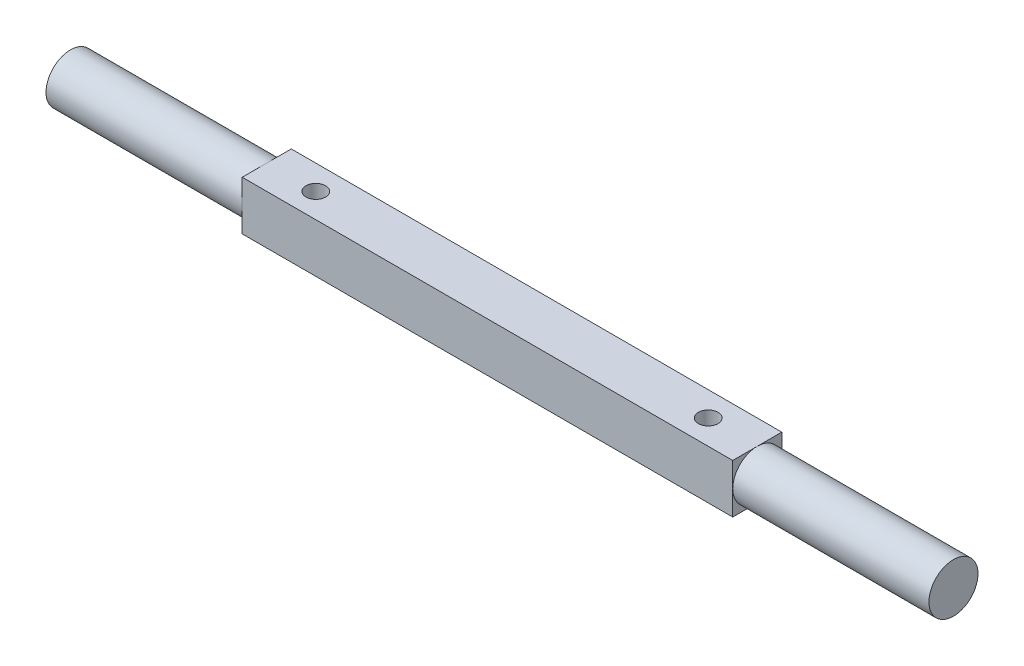
ISO-10303-21;
HEADER;
FILE_DESCRIPTION(('STEP AP214'),'2;1');
FILE_NAME('part.step','',(''),(''),'','','');
FILE_SCHEMA(('AUTOMOTIVE_DESIGN { 1 0 10303 214 1 1 1 1 }'));
ENDSEC;
DATA;
#1=APPLICATION_CONTEXT('core data for automotive mechanical design processes');
#2=APPLICATION_PROTOCOL_DEFINITION('international standard','automotive_design',2000,#1);
#3=PRODUCT_CONTEXT('',#1,'mechanical');
#4=PRODUCT('Part','Part','',(#3));
#5=PRODUCT_RELATED_PRODUCT_CATEGORY('part','',(#4));
#6=PRODUCT_DEFINITION_FORMATION('','',#4);
#7=PRODUCT_DEFINITION_CONTEXT('part definition',#1,'design');
#8=PRODUCT_DEFINITION('design','',#6,#7);
#9=PRODUCT_DEFINITION_SHAPE('','',#8);
#10=(LENGTH_UNIT() NAMED_UNIT(*) SI_UNIT(.MILLI.,.METRE.));
#11=(NAMED_UNIT(*) PLANE_ANGLE_UNIT() SI_UNIT($,.RADIAN.));
#12=(NAMED_UNIT(*) SI_UNIT($,.STERADIAN.) SOLID_ANGLE_UNIT());
#13=UNCERTAINTY_MEASURE_WITH_UNIT(LENGTH_MEASURE(1.E-05),#10,'distance_accuracy_value','');
#14=(GEOMETRIC_REPRESENTATION_CONTEXT(3) GLOBAL_UNCERTAINTY_ASSIGNED_CONTEXT((#13)) GLOBAL_UNIT_ASSIGNED_CONTEXT((#10,
#11,#12)) REPRESENTATION_CONTEXT('',''));
#15=CARTESIAN_POINT('',(0.,0.,0.));
#16=DIRECTION('',(0.,0.,1.));
#17=DIRECTION('',(1.,0.,0.));
#18=AXIS2_PLACEMENT_3D('',#15,#16,#17);
#19=CARTESIAN_POINT('',(-250.,25.,-25.));
#20=DIRECTION('',(1.,0.,0.));
#21=DIRECTION('',(0.,0.,-1.));
#22=AXIS2_PLACEMENT_3D('',#19,#20,#21);
#23=PLANE('',#22);
#24=CARTESIAN_POINT('',(-250.,0.,0.));
#25=DIRECTION('',(-1.,0.,0.));
#26=DIRECTION('',(0.,0.,1.));
#27=AXIS2_PLACEMENT_3D('',#24,#25,#26);
#28=CIRCLE('',#27,25.);
#29=CARTESIAN_POINT('',(-250.,0.,25.));
#30=VERTEX_POINT('',#29);
#31=CARTESIAN_POINT('',(-250.,25.,0.));
#32=VERTEX_POINT('',#31);
#33=EDGE_CURVE('E57',#30,#32,#28,.T.);
#34=ORIENTED_EDGE('',*,*,#33,.F.);
#35=DIRECTION('',(0.,-1.,0.));
#36=VECTOR('',#35,1.);
#37=CARTESIAN_POINT('',(-250.,25.,25.));
#38=LINE('',#37,#36);
#39=CARTESIAN_POINT('',(-250.,25.,25.));
#40=VERTEX_POINT('',#39);
#41=EDGE_CURVE('E114',#40,#30,#38,.T.);
#42=ORIENTED_EDGE('',*,*,#41,.F.);
#43=DIRECTION('',(0.,0.,1.));
#44=VECTOR('',#43,1.);
#45=CARTESIAN_POINT('',(-250.,25.,-25.));
#46=LINE('',#45,#44);
#47=EDGE_CURVE('E137',#32,#40,#46,.T.);
#48=ORIENTED_EDGE('',*,*,#47,.F.);
#49=EDGE_LOOP('',(#34,#42,#48));
#50=FACE_BOUND('',#49,.T.);
#51=ADVANCED_FACE('F45',(#50),#23,.F.);
#52=CARTESIAN_POINT('',(-250.,0.,-25.));
#53=VERTEX_POINT('',#52);
#54=EDGE_CURVE('E11',#32,#53,#28,.T.);
#55=ORIENTED_EDGE('',*,*,#54,.F.);
#56=CARTESIAN_POINT('',(-250.,25.,-25.));
#57=VERTEX_POINT('',#56);
#58=EDGE_CURVE('E185',#57,#32,#46,.T.);
#59=ORIENTED_EDGE('',*,*,#58,.F.);
#60=DIRECTION('',(0.,-1.,0.));
#61=VECTOR('',#60,1.);
#62=CARTESIAN_POINT('',(-250.,25.,-25.));
#63=LINE('',#62,#61);
#64=EDGE_CURVE('E207',#57,#53,#63,.T.);
#65=ORIENTED_EDGE('',*,*,#64,.T.);
#66=EDGE_LOOP('',(#55,#59,#65));
#67=FACE_BOUND('',#66,.T.);
#68=ADVANCED_FACE('F245',(#67),#23,.F.);
#69=CARTESIAN_POINT('',(-250.,-25.,0.));
#70=VERTEX_POINT('',#69);
#71=EDGE_CURVE('E55',#53,#70,#28,.T.);
#72=ORIENTED_EDGE('',*,*,#71,.F.);
#73=CARTESIAN_POINT('',(-250.,-25.,-25.));
#74=VERTEX_POINT('',#73);
#75=EDGE_CURVE('E125',#53,#74,#63,.T.);
#76=ORIENTED_EDGE('',*,*,#75,.T.);
#77=DIRECTION('',(0.,0.,1.));
#78=VECTOR('',#77,1.);
#79=CARTESIAN_POINT('',(-250.,-25.,-25.));
#80=LINE('',#79,#78);
#81=EDGE_CURVE('E199',#74,#70,#80,.T.);
#82=ORIENTED_EDGE('',*,*,#81,.T.);
#83=EDGE_LOOP('',(#72,#76,#82));
#84=FACE_BOUND('',#83,.T.);
#85=ADVANCED_FACE('F213',(#84),#23,.F.);
#86=CARTESIAN_POINT('',(250.,25.,-25.));
#87=DIRECTION('',(-1.,0.,0.));
#88=DIRECTION('',(0.,0.,1.));
#89=AXIS2_PLACEMENT_3D('',#86,#87,#88);
#90=PLANE('',#89);
#91=CARTESIAN_POINT('',(250.,0.,0.));
#92=DIRECTION('',(1.,0.,0.));
#93=DIRECTION('',(0.,0.,-1.));
#94=AXIS2_PLACEMENT_3D('',#91,#92,#93);
#95=CIRCLE('',#94,25.);
#96=CARTESIAN_POINT('',(250.,0.,-25.));
#97=VERTEX_POINT('',#96);
#98=CARTESIAN_POINT('',(250.,25.,0.));
#99=VERTEX_POINT('',#98);
#100=EDGE_CURVE('E150',#97,#99,#95,.T.);
#101=ORIENTED_EDGE('',*,*,#100,.F.);
#102=DIRECTION('',(0.,-1.,0.));
#103=VECTOR('',#102,1.);
#104=CARTESIAN_POINT('',(250.,25.,-25.));
#105=LINE('',#104,#103);
#106=CARTESIAN_POINT('',(250.,25.,-25.));
#107=VERTEX_POINT('',#106);
#108=EDGE_CURVE('E49',#107,#97,#105,.T.);
#109=ORIENTED_EDGE('',*,*,#108,.F.);
#110=DIRECTION('',(0.,0.,-1.));
#111=VECTOR('',#110,1.);
#112=CARTESIAN_POINT('',(250.,25.,-25.));
#113=LINE('',#112,#111);
#114=EDGE_CURVE('E182',#99,#107,#113,.T.);
#115=ORIENTED_EDGE('',*,*,#114,.F.);
#116=EDGE_LOOP('',(#101,#109,#115));
#117=FACE_BOUND('',#116,.T.);
#118=ADVANCED_FACE('F258',(#117),#90,.F.);
#119=CARTESIAN_POINT('',(250.,0.,25.));
#120=VERTEX_POINT('',#119);
#121=EDGE_CURVE('E144',#99,#120,#95,.T.);
#122=ORIENTED_EDGE('',*,*,#121,.F.);
#123=CARTESIAN_POINT('',(250.,25.,25.));
#124=VERTEX_POINT('',#123);
#125=EDGE_CURVE('E177',#124,#99,#113,.T.);
#126=ORIENTED_EDGE('',*,*,#125,.F.);
#127=DIRECTION('',(0.,-1.,0.));
#128=VECTOR('',#127,1.);
#129=CARTESIAN_POINT('',(250.,25.,25.));
#130=LINE('',#129,#128);
#131=EDGE_CURVE('E135',#124,#120,#130,.T.);
#132=ORIENTED_EDGE('',*,*,#131,.T.);
#133=EDGE_LOOP('',(#122,#126,#132));
#134=FACE_BOUND('',#133,.T.);
#135=ADVANCED_FACE('F262',(#134),#90,.F.);
#136=CARTESIAN_POINT('',(250.,-25.,0.));
#137=VERTEX_POINT('',#136);
#138=EDGE_CURVE('E148',#120,#137,#95,.T.);
#139=ORIENTED_EDGE('',*,*,#138,.F.);
#140=CARTESIAN_POINT('',(250.,-25.,25.));
#141=VERTEX_POINT('',#140);
#142=EDGE_CURVE('E190',#120,#141,#130,.T.);
#143=ORIENTED_EDGE('',*,*,#142,.T.);
#144=DIRECTION('',(0.,0.,-1.));
#145=VECTOR('',#144,1.);
#146=CARTESIAN_POINT('',(250.,-25.,-25.));
#147=LINE('',#146,#145);
#148=EDGE_CURVE('E191',#141,#137,#147,.T.);
#149=ORIENTED_EDGE('',*,*,#148,.T.);
#150=EDGE_LOOP('',(#139,#143,#149));
#151=FACE_BOUND('',#150,.T.);
#152=ADVANCED_FACE('F268',(#151),#90,.F.);
#153=EDGE_CURVE('E160',#137,#97,#95,.T.);
#154=ORIENTED_EDGE('',*,*,#153,.F.);
#155=CARTESIAN_POINT('',(250.,-25.,-25.));
#156=VERTEX_POINT('',#155);
#157=EDGE_CURVE('E165',#137,#156,#147,.T.);
#158=ORIENTED_EDGE('',*,*,#157,.T.);
#159=EDGE_CURVE('E209',#97,#156,#105,.T.);
#160=ORIENTED_EDGE('',*,*,#159,.F.);
#161=EDGE_LOOP('',(#154,#158,#160));
#162=FACE_BOUND('',#161,.T.);
#163=ADVANCED_FACE('F47',(#162),#90,.F.);
#164=CARTESIAN_POINT('',(-250.,25.,-25.));
#165=DIRECTION('',(0.,0.,1.));
#166=DIRECTION('',(1.,0.,0.));
#167=AXIS2_PLACEMENT_3D('',#164,#165,#166);
#168=PLANE('',#167);
#169=DIRECTION('',(-1.,0.,0.));
#170=VECTOR('',#169,1.);
#171=CARTESIAN_POINT('',(-250.,-25.,-25.));
#172=LINE('',#171,#170);
#173=EDGE_CURVE('E195',#156,#74,#172,.T.);
#174=ORIENTED_EDGE('',*,*,#173,.T.);
#175=ORIENTED_EDGE('',*,*,#75,.F.);
#176=ORIENTED_EDGE('',*,*,#64,.F.);
#177=DIRECTION('',(-1.,0.,0.));
#178=VECTOR('',#177,1.);
#179=CARTESIAN_POINT('',(-250.,25.,-25.));
#180=LINE('',#179,#178);
#181=EDGE_CURVE('E181',#107,#57,#180,.T.);
#182=ORIENTED_EDGE('',*,*,#181,.F.);
#183=ORIENTED_EDGE('',*,*,#108,.T.);
#184=ORIENTED_EDGE('',*,*,#159,.T.);
#185=EDGE_LOOP('',(#174,#175,#176,#182,#183,#184));
#186=FACE_BOUND('',#185,.T.);
#187=ADVANCED_FACE('F217',(#186),#168,.F.);
#188=EDGE_CURVE('E130',#70,#30,#28,.T.);
#189=ORIENTED_EDGE('',*,*,#188,.F.);
#190=CARTESIAN_POINT('',(-250.,-25.,25.));
#191=VERTEX_POINT('',#190);
#192=EDGE_CURVE('E132',#70,#191,#80,.T.);
#193=ORIENTED_EDGE('',*,*,#192,.T.);
#194=EDGE_CURVE('E118',#30,#191,#38,.T.);
#195=ORIENTED_EDGE('',*,*,#194,.F.);
#196=EDGE_LOOP('',(#189,#193,#195));
#197=FACE_BOUND('',#196,.T.);
#198=ADVANCED_FACE('F128',(#197),#23,.F.);
#199=CARTESIAN_POINT('',(-250.,25.,25.));
#200=DIRECTION('',(0.,0.,-1.));
#201=DIRECTION('',(-1.,0.,0.));
#202=AXIS2_PLACEMENT_3D('',#199,#200,#201);
#203=PLANE('',#202);
#204=DIRECTION('',(1.,0.,0.));
#205=VECTOR('',#204,1.);
#206=CARTESIAN_POINT('',(-250.,-25.,25.));
#207=LINE('',#206,#205);
#208=EDGE_CURVE('E202',#191,#141,#207,.T.);
#209=ORIENTED_EDGE('',*,*,#208,.T.);
#210=ORIENTED_EDGE('',*,*,#142,.F.);
#211=ORIENTED_EDGE('',*,*,#131,.F.);
#212=DIRECTION('',(1.,0.,0.));
#213=VECTOR('',#212,1.);
#214=CARTESIAN_POINT('',(-250.,25.,25.));
#215=LINE('',#214,#213);
#216=EDGE_CURVE('E121',#40,#124,#215,.T.);
#217=ORIENTED_EDGE('',*,*,#216,.F.);
#218=ORIENTED_EDGE('',*,*,#41,.T.);
#219=ORIENTED_EDGE('',*,*,#194,.T.);
#220=EDGE_LOOP('',(#209,#210,#211,#217,#218,#219));
#221=FACE_BOUND('',#220,.T.);
#222=ADVANCED_FACE('F117',(#221),#203,.F.);
#223=CARTESIAN_POINT('',(0.,25.,0.));
#224=DIRECTION('',(0.,1.,0.));
#225=DIRECTION('',(0.,0.,1.));
#226=AXIS2_PLACEMENT_3D('',#223,#224,#225);
#227=PLANE('',#226);
#228=CARTESIAN_POINT('',(200.,25.,0.));
#229=DIRECTION('',(0.,1.,0.));
#230=DIRECTION('',(0.,0.,1.));
#231=AXIS2_PLACEMENT_3D('',#228,#229,#230);
#232=CIRCLE('',#231,10.);
#233=CARTESIAN_POINT('',(200.,25.,10.));
#234=VERTEX_POINT('',#233);
#235=EDGE_CURVE('E166',#234,#234,#232,.T.);
#236=ORIENTED_EDGE('',*,*,#235,.F.);
#237=EDGE_LOOP('',(#236));
#238=FACE_BOUND('',#237,.T.);
#239=CARTESIAN_POINT('',(-200.,25.,0.));
#240=DIRECTION('',(0.,1.,0.));
#241=DIRECTION('',(0.,0.,-1.));
#242=AXIS2_PLACEMENT_3D('',#239,#240,#241);
#243=CIRCLE('',#242,10.);
#244=CARTESIAN_POINT('',(-200.,25.,-10.));
#245=VERTEX_POINT('',#244);
#246=EDGE_CURVE('E170',#245,#245,#243,.T.);
#247=ORIENTED_EDGE('',*,*,#246,.F.);
#248=EDGE_LOOP('',(#247));
#249=FACE_BOUND('',#248,.T.);
#250=ORIENTED_EDGE('',*,*,#125,.T.);
#251=ORIENTED_EDGE('',*,*,#114,.T.);
#252=ORIENTED_EDGE('',*,*,#181,.T.);
#253=ORIENTED_EDGE('',*,*,#58,.T.);
#254=ORIENTED_EDGE('',*,*,#47,.T.);
#255=ORIENTED_EDGE('',*,*,#216,.T.);
#256=EDGE_LOOP('',(#250,#251,#252,#253,#254,#255));
#257=FACE_BOUND('',#256,.T.);
#258=ADVANCED_FACE('F256',(#238,#249,#257),#227,.T.);
#259=CARTESIAN_POINT('',(0.,-25.,0.));
#260=DIRECTION('',(0.,1.,0.));
#261=DIRECTION('',(0.,0.,1.));
#262=AXIS2_PLACEMENT_3D('',#259,#260,#261);
#263=PLANE('',#262);
#264=CARTESIAN_POINT('',(200.,-25.,0.));
#265=DIRECTION('',(0.,1.,0.));
#266=DIRECTION('',(0.,0.,1.));
#267=AXIS2_PLACEMENT_3D('',#264,#265,#266);
#268=CIRCLE('',#267,10.);
#269=CARTESIAN_POINT('',(200.,-25.,10.));
#270=VERTEX_POINT('',#269);
#271=EDGE_CURVE('E161',#270,#270,#268,.T.);
#272=ORIENTED_EDGE('',*,*,#271,.T.);
#273=EDGE_LOOP('',(#272));
#274=FACE_BOUND('',#273,.T.);
#275=CARTESIAN_POINT('',(-200.,-25.,0.));
#276=DIRECTION('',(0.,1.,0.));
#277=DIRECTION('',(0.,0.,-1.));
#278=AXIS2_PLACEMENT_3D('',#275,#276,#277);
#279=CIRCLE('',#278,10.);
#280=CARTESIAN_POINT('',(-200.,-25.,-10.));
#281=VERTEX_POINT('',#280);
#282=EDGE_CURVE('E156',#281,#281,#279,.T.);
#283=ORIENTED_EDGE('',*,*,#282,.T.);
#284=EDGE_LOOP('',(#283));
#285=FACE_BOUND('',#284,.T.);
#286=ORIENTED_EDGE('',*,*,#148,.F.);
#287=ORIENTED_EDGE('',*,*,#208,.F.);
#288=ORIENTED_EDGE('',*,*,#192,.F.);
#289=ORIENTED_EDGE('',*,*,#81,.F.);
#290=ORIENTED_EDGE('',*,*,#173,.F.);
#291=ORIENTED_EDGE('',*,*,#157,.F.);
#292=EDGE_LOOP('',(#286,#287,#288,#289,#290,#291));
#293=FACE_BOUND('',#292,.T.);
#294=ADVANCED_FACE('F223',(#274,#285,#293),#263,.F.);
#295=CARTESIAN_POINT('',(-200.,-25.,0.));
#296=DIRECTION('',(0.,1.,0.));
#297=DIRECTION('',(0.,0.,1.));
#298=AXIS2_PLACEMENT_3D('',#295,#296,#297);
#299=CYLINDRICAL_SURFACE('',#298,10.);
#300=ORIENTED_EDGE('',*,*,#282,.F.);
#301=EDGE_LOOP('',(#300));
#302=FACE_BOUND('',#301,.T.);
#303=ORIENTED_EDGE('',*,*,#246,.T.);
#304=EDGE_LOOP('',(#303));
#305=FACE_BOUND('',#304,.T.);
#306=ADVANCED_FACE('F298',(#302,#305),#299,.F.);
#307=CARTESIAN_POINT('',(200.,-25.,0.));
#308=DIRECTION('',(0.,1.,0.));
#309=DIRECTION('',(0.,0.,1.));
#310=AXIS2_PLACEMENT_3D('',#307,#308,#309);
#311=CYLINDRICAL_SURFACE('',#310,10.);
#312=ORIENTED_EDGE('',*,*,#271,.F.);
#313=EDGE_LOOP('',(#312));
#314=FACE_BOUND('',#313,.T.);
#315=ORIENTED_EDGE('',*,*,#235,.T.);
#316=EDGE_LOOP('',(#315));
#317=FACE_BOUND('',#316,.T.);
#318=ADVANCED_FACE('F306',(#314,#317),#311,.F.);
#319=CARTESIAN_POINT('',(450.,0.,0.));
#320=DIRECTION('',(-1.,0.,0.));
#321=DIRECTION('',(0.,0.,1.));
#322=AXIS2_PLACEMENT_3D('',#319,#320,#321);
#323=CYLINDRICAL_SURFACE('',#322,25.);
#324=CARTESIAN_POINT('',(450.,0.,0.));
#325=DIRECTION('',(1.,0.,0.));
#326=DIRECTION('',(0.,0.,-1.));
#327=AXIS2_PLACEMENT_3D('',#324,#325,#326);
#328=CIRCLE('',#327,25.);
#329=CARTESIAN_POINT('',(450.,0.,-25.));
#330=VERTEX_POINT('',#329);
#331=EDGE_CURVE('E153',#330,#330,#328,.T.);
#332=ORIENTED_EDGE('',*,*,#331,.F.);
#333=EDGE_LOOP('',(#332));
#334=FACE_BOUND('',#333,.T.);
#335=ORIENTED_EDGE('',*,*,#100,.T.);
#336=ORIENTED_EDGE('',*,*,#121,.T.);
#337=ORIENTED_EDGE('',*,*,#138,.T.);
#338=ORIENTED_EDGE('',*,*,#153,.T.);
#339=EDGE_LOOP('',(#335,#336,#337,#338));
#340=FACE_BOUND('',#339,.T.);
#341=ADVANCED_FACE('F241',(#334,#340),#323,.T.);
#342=CARTESIAN_POINT('',(450.,0.,0.));
#343=DIRECTION('',(1.,0.,0.));
#344=DIRECTION('',(0.,0.,-1.));
#345=AXIS2_PLACEMENT_3D('',#342,#343,#344);
#346=PLANE('',#345);
#347=ORIENTED_EDGE('',*,*,#331,.T.);
#348=EDGE_LOOP('',(#347));
#349=FACE_BOUND('',#348,.T.);
#350=ADVANCED_FACE('F233',(#349),#346,.T.);
#351=CARTESIAN_POINT('',(-450.,0.,0.));
#352=DIRECTION('',(1.,0.,0.));
#353=DIRECTION('',(0.,0.,-1.));
#354=AXIS2_PLACEMENT_3D('',#351,#352,#353);
#355=CYLINDRICAL_SURFACE('',#354,25.);
#356=CARTESIAN_POINT('',(-450.,0.,0.));
#357=DIRECTION('',(-1.,0.,0.));
#358=DIRECTION('',(0.,0.,1.));
#359=AXIS2_PLACEMENT_3D('',#356,#357,#358);
#360=CIRCLE('',#359,25.);
#361=CARTESIAN_POINT('',(-450.,0.,25.));
#362=VERTEX_POINT('',#361);
#363=EDGE_CURVE('E141',#362,#362,#360,.T.);
#364=ORIENTED_EDGE('',*,*,#363,.F.);
#365=EDGE_LOOP('',(#364));
#366=FACE_BOUND('',#365,.T.);
#367=ORIENTED_EDGE('',*,*,#33,.T.);
#368=ORIENTED_EDGE('',*,*,#54,.T.);
#369=ORIENTED_EDGE('',*,*,#71,.T.);
#370=ORIENTED_EDGE('',*,*,#188,.T.);
#371=EDGE_LOOP('',(#367,#368,#369,#370));
#372=FACE_BOUND('',#371,.T.);
#373=ADVANCED_FACE('F142',(#366,#372),#355,.T.);
#374=CARTESIAN_POINT('',(-450.,0.,0.));
#375=DIRECTION('',(-1.,0.,0.));
#376=DIRECTION('',(0.,0.,1.));
#377=AXIS2_PLACEMENT_3D('',#374,#375,#376);
#378=PLANE('',#377);
#379=ORIENTED_EDGE('',*,*,#363,.T.);
#380=EDGE_LOOP('',(#379));
#381=FACE_BOUND('',#380,.T.);
#382=ADVANCED_FACE('F230',(#381),#378,.T.);
#383=CLOSED_SHELL('',(#51,#68,#85,#118,#135,#152,#163,#187,#198,#222,#258,#294,#306,#318,#341,
#350,#373,#382));
#384=MANIFOLD_SOLID_BREP('B2',#383);
#385=ADVANCED_BREP_SHAPE_REPRESENTATION('',(#18,#384),#14);
#386=SHAPE_DEFINITION_REPRESENTATION(#9,#385);
ENDSEC;
END-ISO-10303-21;
